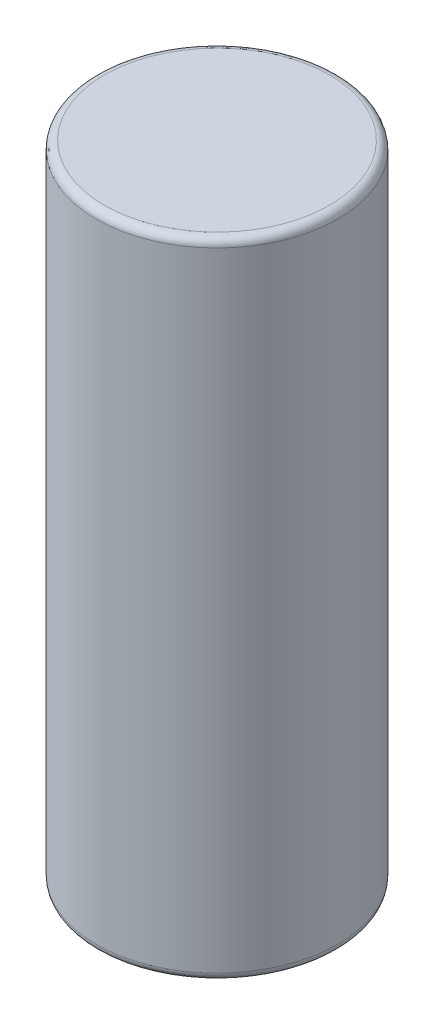
ISO-10303-21;
HEADER;
FILE_DESCRIPTION(('STEP AP214'),'2;1');
FILE_NAME('part.step','',(''),(''),'','','');
FILE_SCHEMA(('AUTOMOTIVE_DESIGN { 1 0 10303 214 1 1 1 1 }'));
ENDSEC;
DATA;
#1=APPLICATION_CONTEXT('core data for automotive mechanical design processes');
#2=APPLICATION_PROTOCOL_DEFINITION('international standard','automotive_design',2000,#1);
#3=PRODUCT_CONTEXT('',#1,'mechanical');
#4=PRODUCT('Part','Part','',(#3));
#5=PRODUCT_RELATED_PRODUCT_CATEGORY('part','',(#4));
#6=PRODUCT_DEFINITION_FORMATION('','',#4);
#7=PRODUCT_DEFINITION_CONTEXT('part definition',#1,'design');
#8=PRODUCT_DEFINITION('design','',#6,#7);
#9=PRODUCT_DEFINITION_SHAPE('','',#8);
#10=(LENGTH_UNIT() NAMED_UNIT(*) SI_UNIT(.MILLI.,.METRE.));
#11=(NAMED_UNIT(*) PLANE_ANGLE_UNIT() SI_UNIT($,.RADIAN.));
#12=(NAMED_UNIT(*) SI_UNIT($,.STERADIAN.) SOLID_ANGLE_UNIT());
#13=UNCERTAINTY_MEASURE_WITH_UNIT(LENGTH_MEASURE(1.E-05),#10,'distance_accuracy_value','');
#14=(GEOMETRIC_REPRESENTATION_CONTEXT(3) GLOBAL_UNCERTAINTY_ASSIGNED_CONTEXT((#13)) GLOBAL_UNIT_ASSIGNED_CONTEXT((#10,
#11,#12)) REPRESENTATION_CONTEXT('',''));
#15=CARTESIAN_POINT('',(0.,0.,0.));
#16=DIRECTION('',(0.,0.,1.));
#17=DIRECTION('',(1.,0.,0.));
#18=AXIS2_PLACEMENT_3D('',#15,#16,#17);
#19=CARTESIAN_POINT('',(0.,-200.,0.));
#20=DIRECTION('',(0.,-1.,0.));
#21=DIRECTION('',(0.,0.,-1.));
#22=AXIS2_PLACEMENT_3D('',#19,#20,#21);
#23=PLANE('',#22);
#24=CARTESIAN_POINT('',(0.,-200.,0.));
#25=DIRECTION('',(0.,-1.,0.));
#26=DIRECTION('',(0.,0.,-1.));
#27=AXIS2_PLACEMENT_3D('',#24,#25,#26);
#28=CIRCLE('',#27,70.);
#29=CARTESIAN_POINT('',(0.,-200.,-70.));
#30=VERTEX_POINT('',#29);
#31=EDGE_CURVE('E52',#30,#30,#28,.T.);
#32=ORIENTED_EDGE('',*,*,#31,.T.);
#33=EDGE_LOOP('',(#32));
#34=FACE_BOUND('',#33,.T.);
#35=ADVANCED_FACE('F37',(#34),#23,.T.);
#36=CARTESIAN_POINT('',(0.,0.,0.));
#37=DIRECTION('',(0.,-1.,0.));
#38=DIRECTION('',(0.,0.,-1.));
#39=AXIS2_PLACEMENT_3D('',#36,#37,#38);
#40=CYLINDRICAL_SURFACE('',#39,75.);
#41=CARTESIAN_POINT('',(0.,-195.,0.));
#42=DIRECTION('',(0.,-1.,0.));
#43=DIRECTION('',(0.,0.,-1.));
#44=AXIS2_PLACEMENT_3D('',#41,#42,#43);
#45=CIRCLE('',#44,75.);
#46=CARTESIAN_POINT('',(0.,-195.,-75.));
#47=VERTEX_POINT('',#46);
#48=EDGE_CURVE('E44',#47,#47,#45,.F.);
#49=ORIENTED_EDGE('',*,*,#48,.T.);
#50=EDGE_LOOP('',(#49));
#51=FACE_BOUND('',#50,.T.);
#52=CARTESIAN_POINT('',(0.,195.,0.));
#53=DIRECTION('',(0.,1.,0.));
#54=DIRECTION('',(0.,0.,1.));
#55=AXIS2_PLACEMENT_3D('',#52,#53,#54);
#56=CIRCLE('',#55,75.);
#57=CARTESIAN_POINT('',(0.,195.,75.));
#58=VERTEX_POINT('',#57);
#59=EDGE_CURVE('E48',#58,#58,#56,.F.);
#60=ORIENTED_EDGE('',*,*,#59,.T.);
#61=EDGE_LOOP('',(#60));
#62=FACE_BOUND('',#61,.T.);
#63=ADVANCED_FACE('F68',(#51,#62),#40,.T.);
#64=CARTESIAN_POINT('',(0.,200.,0.));
#65=DIRECTION('',(0.,1.,0.));
#66=DIRECTION('',(0.,0.,1.));
#67=AXIS2_PLACEMENT_3D('',#64,#65,#66);
#68=PLANE('',#67);
#69=CARTESIAN_POINT('',(0.,200.,0.));
#70=DIRECTION('',(0.,1.,0.));
#71=DIRECTION('',(0.,0.,1.));
#72=AXIS2_PLACEMENT_3D('',#69,#70,#71);
#73=CIRCLE('',#72,70.);
#74=CARTESIAN_POINT('',(0.,200.,70.));
#75=VERTEX_POINT('',#74);
#76=EDGE_CURVE('E10',#75,#75,#73,.T.);
#77=ORIENTED_EDGE('',*,*,#76,.T.);
#78=EDGE_LOOP('',(#77));
#79=FACE_BOUND('',#78,.T.);
#80=ADVANCED_FACE('F61',(#79),#68,.T.);
#81=CARTESIAN_POINT('',(0.,-195.,0.));
#82=DIRECTION('',(0.,-1.,0.));
#83=DIRECTION('',(0.,0.,-1.));
#84=AXIS2_PLACEMENT_3D('',#81,#82,#83);
#85=TOROIDAL_SURFACE('',#84,70.,5.);
#86=ORIENTED_EDGE('',*,*,#48,.F.);
#87=EDGE_LOOP('',(#86));
#88=FACE_BOUND('',#87,.T.);
#89=ORIENTED_EDGE('',*,*,#31,.F.);
#90=EDGE_LOOP('',(#89));
#91=FACE_BOUND('',#90,.T.);
#92=ADVANCED_FACE('F59',(#88,#91),#85,.T.);
#93=CARTESIAN_POINT('',(0.,195.,0.));
#94=DIRECTION('',(0.,1.,0.));
#95=DIRECTION('',(0.,0.,1.));
#96=AXIS2_PLACEMENT_3D('',#93,#94,#95);
#97=TOROIDAL_SURFACE('',#96,70.,5.);
#98=ORIENTED_EDGE('',*,*,#76,.F.);
#99=EDGE_LOOP('',(#98));
#100=FACE_BOUND('',#99,.T.);
#101=ORIENTED_EDGE('',*,*,#59,.F.);
#102=EDGE_LOOP('',(#101));
#103=FACE_BOUND('',#102,.T.);
#104=ADVANCED_FACE('F39',(#100,#103),#97,.T.);
#105=CLOSED_SHELL('',(#35,#63,#80,#92,#104));
#106=MANIFOLD_SOLID_BREP('B2',#105);
#107=ADVANCED_BREP_SHAPE_REPRESENTATION('',(#18,#106),#14);
#108=SHAPE_DEFINITION_REPRESENTATION(#9,#107);
ENDSEC;
END-ISO-10303-21;
